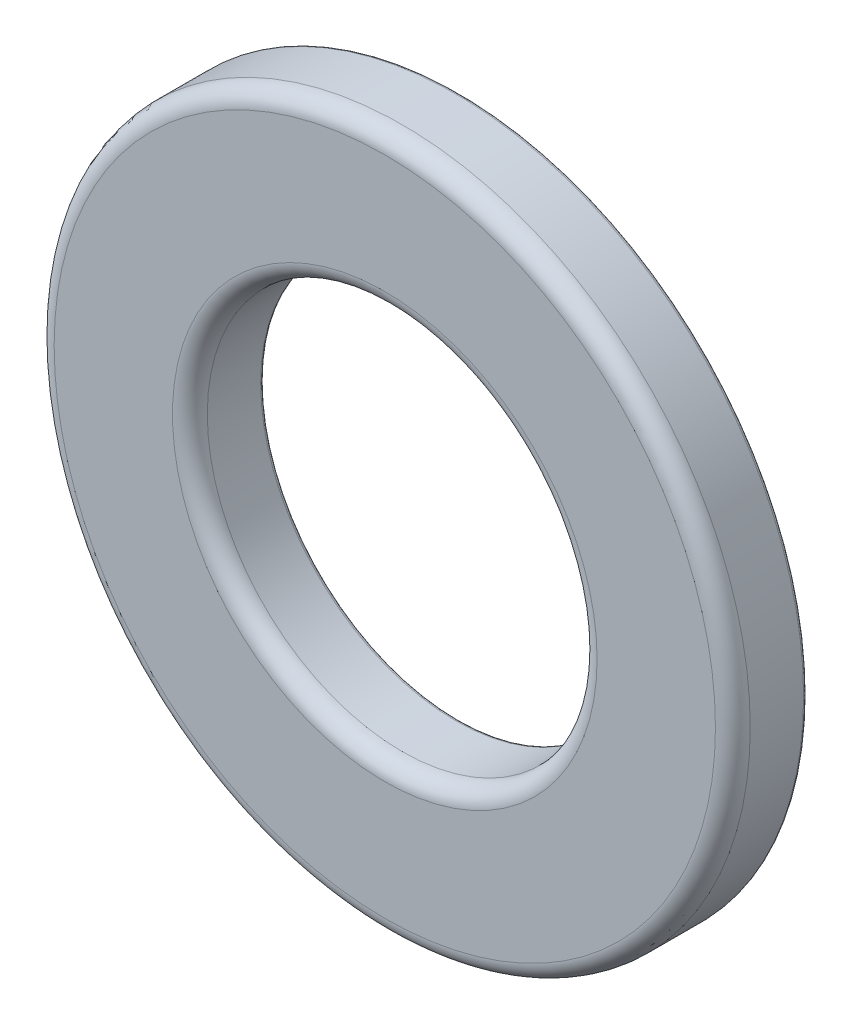
ISO-10303-21;
HEADER;
FILE_DESCRIPTION(('STEP AP214'),'2;1');
FILE_NAME('part.step','',(''),(''),'','','');
FILE_SCHEMA(('AUTOMOTIVE_DESIGN { 1 0 10303 214 1 1 1 1 }'));
ENDSEC;
DATA;
#1=APPLICATION_CONTEXT('core data for automotive mechanical design processes');
#2=APPLICATION_PROTOCOL_DEFINITION('international standard','automotive_design',2000,#1);
#3=PRODUCT_CONTEXT('',#1,'mechanical');
#4=PRODUCT('Part','Part','',(#3));
#5=PRODUCT_RELATED_PRODUCT_CATEGORY('part','',(#4));
#6=PRODUCT_DEFINITION_FORMATION('','',#4);
#7=PRODUCT_DEFINITION_CONTEXT('part definition',#1,'design');
#8=PRODUCT_DEFINITION('design','',#6,#7);
#9=PRODUCT_DEFINITION_SHAPE('','',#8);
#10=(LENGTH_UNIT() NAMED_UNIT(*) SI_UNIT(.MILLI.,.METRE.));
#11=(NAMED_UNIT(*) PLANE_ANGLE_UNIT() SI_UNIT($,.RADIAN.));
#12=(NAMED_UNIT(*) SI_UNIT($,.STERADIAN.) SOLID_ANGLE_UNIT());
#13=UNCERTAINTY_MEASURE_WITH_UNIT(LENGTH_MEASURE(1.E-05),#10,'distance_accuracy_value','');
#14=(GEOMETRIC_REPRESENTATION_CONTEXT(3) GLOBAL_UNCERTAINTY_ASSIGNED_CONTEXT((#13)) GLOBAL_UNIT_ASSIGNED_CONTEXT((#10,
#11,#12)) REPRESENTATION_CONTEXT('',''));
#15=CARTESIAN_POINT('',(0.,0.,0.));
#16=DIRECTION('',(0.,0.,1.));
#17=DIRECTION('',(1.,0.,0.));
#18=AXIS2_PLACEMENT_3D('',#15,#16,#17);
#19=CARTESIAN_POINT('',(0.,0.,-0.8));
#20=DIRECTION('',(0.,0.,1.));
#21=DIRECTION('',(1.,0.,0.));
#22=AXIS2_PLACEMENT_3D('',#19,#20,#21);
#23=CYLINDRICAL_SURFACE('',#22,7.5);
#24=CARTESIAN_POINT('',(0.,0.,-0.725));
#25=DIRECTION('',(0.,0.,1.));
#26=DIRECTION('',(1.,0.,0.));
#27=AXIS2_PLACEMENT_3D('',#24,#25,#26);
#28=CIRCLE('',#27,7.5);
#29=CARTESIAN_POINT('',(7.5,0.,-0.725));
#30=VERTEX_POINT('',#29);
#31=EDGE_CURVE('E89',#30,#30,#28,.T.);
#32=ORIENTED_EDGE('',*,*,#31,.T.);
#33=EDGE_LOOP('',(#32));
#34=FACE_BOUND('',#33,.T.);
#35=CARTESIAN_POINT('',(0.,0.,0.425));
#36=DIRECTION('',(0.,0.,1.));
#37=DIRECTION('',(1.,0.,0.));
#38=AXIS2_PLACEMENT_3D('',#35,#36,#37);
#39=CIRCLE('',#38,7.5);
#40=CARTESIAN_POINT('',(7.5,0.,0.425));
#41=VERTEX_POINT('',#40);
#42=EDGE_CURVE('E94',#41,#41,#39,.F.);
#43=ORIENTED_EDGE('',*,*,#42,.T.);
#44=EDGE_LOOP('',(#43));
#45=FACE_BOUND('',#44,.T.);
#46=ADVANCED_FACE('F74',(#34,#45),#23,.T.);
#47=CARTESIAN_POINT('',(0.,0.,-0.8));
#48=DIRECTION('',(0.,0.,1.));
#49=DIRECTION('',(1.,0.,0.));
#50=AXIS2_PLACEMENT_3D('',#47,#48,#49);
#51=PLANE('',#50);
#52=CARTESIAN_POINT('',(0.,0.,-0.8));
#53=DIRECTION('',(0.,0.,1.));
#54=DIRECTION('',(1.,0.,0.));
#55=AXIS2_PLACEMENT_3D('',#52,#53,#54);
#56=CIRCLE('',#55,7.425);
#57=CARTESIAN_POINT('',(7.425,0.,-0.8));
#58=VERTEX_POINT('',#57);
#59=EDGE_CURVE('E81',#58,#58,#56,.F.);
#60=ORIENTED_EDGE('',*,*,#59,.T.);
#61=EDGE_LOOP('',(#60));
#62=FACE_BOUND('',#61,.T.);
#63=CARTESIAN_POINT('',(0.,0.,-0.8));
#64=DIRECTION('',(0.,0.,1.));
#65=DIRECTION('',(1.,0.,0.));
#66=AXIS2_PLACEMENT_3D('',#63,#64,#65);
#67=CIRCLE('',#66,4.275);
#68=CARTESIAN_POINT('',(4.275,0.,-0.8));
#69=VERTEX_POINT('',#68);
#70=EDGE_CURVE('E85',#69,#69,#67,.T.);
#71=ORIENTED_EDGE('',*,*,#70,.T.);
#72=EDGE_LOOP('',(#71));
#73=FACE_BOUND('',#72,.T.);
#74=ADVANCED_FACE('F127',(#62,#73),#51,.F.);
#75=CARTESIAN_POINT('',(0.,0.,-0.8));
#76=DIRECTION('',(0.,0.,1.));
#77=DIRECTION('',(1.,0.,0.));
#78=AXIS2_PLACEMENT_3D('',#75,#76,#77);
#79=CYLINDRICAL_SURFACE('',#78,4.2);
#80=CARTESIAN_POINT('',(0.,0.,-0.725));
#81=DIRECTION('',(0.,0.,1.));
#82=DIRECTION('',(1.,0.,0.));
#83=AXIS2_PLACEMENT_3D('',#80,#81,#82);
#84=CIRCLE('',#83,4.2);
#85=CARTESIAN_POINT('',(4.2,0.,-0.725));
#86=VERTEX_POINT('',#85);
#87=EDGE_CURVE('E11',#86,#86,#84,.F.);
#88=ORIENTED_EDGE('',*,*,#87,.T.);
#89=EDGE_LOOP('',(#88));
#90=FACE_BOUND('',#89,.T.);
#91=CARTESIAN_POINT('',(0.,0.,0.425));
#92=DIRECTION('',(0.,0.,1.));
#93=DIRECTION('',(1.,0.,0.));
#94=AXIS2_PLACEMENT_3D('',#91,#92,#93);
#95=CIRCLE('',#94,4.2);
#96=CARTESIAN_POINT('',(4.2,0.,0.425));
#97=VERTEX_POINT('',#96);
#98=EDGE_CURVE('E103',#97,#97,#95,.T.);
#99=ORIENTED_EDGE('',*,*,#98,.T.);
#100=EDGE_LOOP('',(#99));
#101=FACE_BOUND('',#100,.T.);
#102=ADVANCED_FACE('F107',(#90,#101),#79,.F.);
#103=CARTESIAN_POINT('',(0.,0.,0.8));
#104=DIRECTION('',(0.,0.,1.));
#105=DIRECTION('',(1.,0.,0.));
#106=AXIS2_PLACEMENT_3D('',#103,#104,#105);
#107=PLANE('',#106);
#108=CARTESIAN_POINT('',(0.,0.,0.8));
#109=DIRECTION('',(0.,0.,1.));
#110=DIRECTION('',(1.,0.,0.));
#111=AXIS2_PLACEMENT_3D('',#108,#109,#110);
#112=CIRCLE('',#111,4.575);
#113=CARTESIAN_POINT('',(4.575,0.,0.8));
#114=VERTEX_POINT('',#113);
#115=EDGE_CURVE('E97',#114,#114,#112,.F.);
#116=ORIENTED_EDGE('',*,*,#115,.T.);
#117=EDGE_LOOP('',(#116));
#118=FACE_BOUND('',#117,.T.);
#119=CARTESIAN_POINT('',(0.,0.,0.8));
#120=DIRECTION('',(0.,0.,1.));
#121=DIRECTION('',(1.,0.,0.));
#122=AXIS2_PLACEMENT_3D('',#119,#120,#121);
#123=CIRCLE('',#122,7.125);
#124=CARTESIAN_POINT('',(7.125,0.,0.8));
#125=VERTEX_POINT('',#124);
#126=EDGE_CURVE('E100',#125,#125,#123,.T.);
#127=ORIENTED_EDGE('',*,*,#126,.T.);
#128=EDGE_LOOP('',(#127));
#129=FACE_BOUND('',#128,.T.);
#130=ADVANCED_FACE('F112',(#118,#129),#107,.T.);
#131=CARTESIAN_POINT('',(0.,0.,0.425));
#132=DIRECTION('',(0.,0.,1.));
#133=DIRECTION('',(1.,0.,0.));
#134=AXIS2_PLACEMENT_3D('',#131,#132,#133);
#135=TOROIDAL_SURFACE('',#134,4.575,0.375);
#136=ORIENTED_EDGE('',*,*,#115,.F.);
#137=EDGE_LOOP('',(#136));
#138=FACE_BOUND('',#137,.T.);
#139=ORIENTED_EDGE('',*,*,#98,.F.);
#140=EDGE_LOOP('',(#139));
#141=FACE_BOUND('',#140,.T.);
#142=ADVANCED_FACE('F109',(#138,#141),#135,.T.);
#143=CARTESIAN_POINT('',(0.,0.,0.425));
#144=DIRECTION('',(0.,0.,1.));
#145=DIRECTION('',(1.,0.,0.));
#146=AXIS2_PLACEMENT_3D('',#143,#144,#145);
#147=TOROIDAL_SURFACE('',#146,7.125,0.375);
#148=ORIENTED_EDGE('',*,*,#42,.F.);
#149=EDGE_LOOP('',(#148));
#150=FACE_BOUND('',#149,.T.);
#151=ORIENTED_EDGE('',*,*,#126,.F.);
#152=EDGE_LOOP('',(#151));
#153=FACE_BOUND('',#152,.T.);
#154=ADVANCED_FACE('F111',(#150,#153),#147,.T.);
#155=CARTESIAN_POINT('',(0.,0.,-0.725));
#156=DIRECTION('',(0.,0.,1.));
#157=DIRECTION('',(1.,0.,0.));
#158=AXIS2_PLACEMENT_3D('',#155,#156,#157);
#159=TOROIDAL_SURFACE('',#158,7.425,0.075);
#160=ORIENTED_EDGE('',*,*,#59,.F.);
#161=EDGE_LOOP('',(#160));
#162=FACE_BOUND('',#161,.T.);
#163=ORIENTED_EDGE('',*,*,#31,.F.);
#164=EDGE_LOOP('',(#163));
#165=FACE_BOUND('',#164,.T.);
#166=ADVANCED_FACE('F119',(#162,#165),#159,.T.);
#167=CARTESIAN_POINT('',(0.,0.,-0.725));
#168=DIRECTION('',(0.,0.,1.));
#169=DIRECTION('',(1.,0.,0.));
#170=AXIS2_PLACEMENT_3D('',#167,#168,#169);
#171=TOROIDAL_SURFACE('',#170,4.275,0.075);
#172=ORIENTED_EDGE('',*,*,#87,.F.);
#173=EDGE_LOOP('',(#172));
#174=FACE_BOUND('',#173,.T.);
#175=ORIENTED_EDGE('',*,*,#70,.F.);
#176=EDGE_LOOP('',(#175));
#177=FACE_BOUND('',#176,.T.);
#178=ADVANCED_FACE('F76',(#174,#177),#171,.T.);
#179=CLOSED_SHELL('',(#46,#74,#102,#130,#142,#154,#166,#178));
#180=MANIFOLD_SOLID_BREP('B2',#179);
#181=ADVANCED_BREP_SHAPE_REPRESENTATION('',(#18,#180),#14);
#182=SHAPE_DEFINITION_REPRESENTATION(#9,#181);
ENDSEC;
END-ISO-10303-21;
